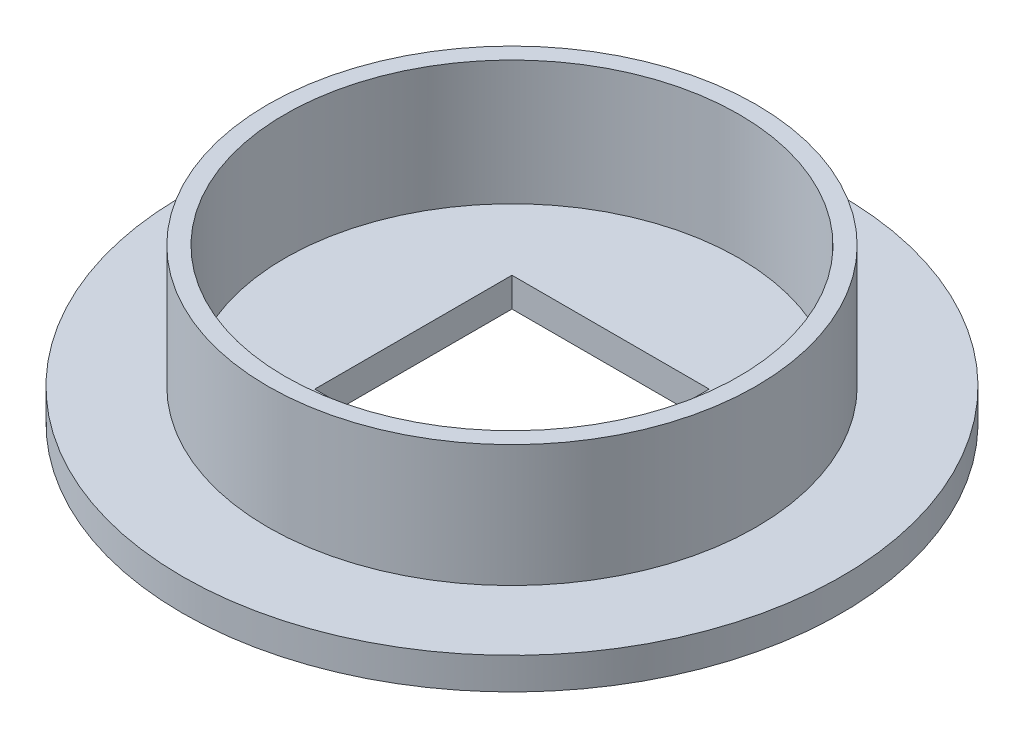
ISO-10303-21;
HEADER;
FILE_DESCRIPTION(('STEP AP214'),'2;1');
FILE_NAME('part.step','',(''),(''),'','','');
FILE_SCHEMA(('AUTOMOTIVE_DESIGN { 1 0 10303 214 1 1 1 1 }'));
ENDSEC;
DATA;
#1=APPLICATION_CONTEXT('core data for automotive mechanical design processes');
#2=APPLICATION_PROTOCOL_DEFINITION('international standard','automotive_design',2000,#1);
#3=PRODUCT_CONTEXT('',#1,'mechanical');
#4=PRODUCT('Part','Part','',(#3));
#5=PRODUCT_RELATED_PRODUCT_CATEGORY('part','',(#4));
#6=PRODUCT_DEFINITION_FORMATION('','',#4);
#7=PRODUCT_DEFINITION_CONTEXT('part definition',#1,'design');
#8=PRODUCT_DEFINITION('design','',#6,#7);
#9=PRODUCT_DEFINITION_SHAPE('','',#8);
#10=(LENGTH_UNIT() NAMED_UNIT(*) SI_UNIT(.MILLI.,.METRE.));
#11=(NAMED_UNIT(*) PLANE_ANGLE_UNIT() SI_UNIT($,.RADIAN.));
#12=(NAMED_UNIT(*) SI_UNIT($,.STERADIAN.) SOLID_ANGLE_UNIT());
#13=UNCERTAINTY_MEASURE_WITH_UNIT(LENGTH_MEASURE(1.E-05),#10,'distance_accuracy_value','');
#14=(GEOMETRIC_REPRESENTATION_CONTEXT(3) GLOBAL_UNCERTAINTY_ASSIGNED_CONTEXT((#13)) GLOBAL_UNIT_ASSIGNED_CONTEXT((#10,
#11,#12)) REPRESENTATION_CONTEXT('',''));
#15=CARTESIAN_POINT('',(0.,0.,0.));
#16=DIRECTION('',(0.,0.,1.));
#17=DIRECTION('',(1.,0.,0.));
#18=AXIS2_PLACEMENT_3D('',#15,#16,#17);
#19=CARTESIAN_POINT('',(0.,25.5,0.));
#20=DIRECTION('',(0.,1.,0.));
#21=DIRECTION('',(0.,0.,1.));
#22=AXIS2_PLACEMENT_3D('',#19,#20,#21);
#23=PLANE('',#22);
#24=CARTESIAN_POINT('',(0.,25.5,0.));
#25=DIRECTION('',(0.,1.,0.));
#26=DIRECTION('',(0.,0.,1.));
#27=AXIS2_PLACEMENT_3D('',#24,#25,#26);
#28=CIRCLE('',#27,50.);
#29=CARTESIAN_POINT('',(0.,25.5,50.));
#30=VERTEX_POINT('',#29);
#31=EDGE_CURVE('E194',#30,#30,#28,.T.);
#32=ORIENTED_EDGE('',*,*,#31,.T.);
#33=EDGE_LOOP('',(#32));
#34=FACE_BOUND('',#33,.T.);
#35=CARTESIAN_POINT('',(0.,25.5,0.));
#36=DIRECTION('',(0.,1.,0.));
#37=DIRECTION('',(0.,0.,1.));
#38=AXIS2_PLACEMENT_3D('',#35,#36,#37);
#39=CIRCLE('',#38,46.5);
#40=CARTESIAN_POINT('',(0.,25.5,46.5));
#41=VERTEX_POINT('',#40);
#42=EDGE_CURVE('E197',#41,#41,#39,.T.);
#43=ORIENTED_EDGE('',*,*,#42,.F.);
#44=EDGE_LOOP('',(#43));
#45=FACE_BOUND('',#44,.T.);
#46=ADVANCED_FACE('F42',(#34,#45),#23,.T.);
#47=CARTESIAN_POINT('',(0.,41.,0.));
#48=DIRECTION('',(0.,-1.,0.));
#49=DIRECTION('',(0.,0.,-1.));
#50=AXIS2_PLACEMENT_3D('',#47,#48,#49);
#51=CYLINDRICAL_SURFACE('',#50,46.5);
#52=CARTESIAN_POINT('',(0.,0.,0.));
#53=DIRECTION('',(0.,-1.,0.));
#54=DIRECTION('',(0.,0.,-1.));
#55=AXIS2_PLACEMENT_3D('',#52,#53,#54);
#56=CIRCLE('',#55,46.5);
#57=CARTESIAN_POINT('',(0.,0.,-46.5));
#58=VERTEX_POINT('',#57);
#59=EDGE_CURVE('E119',#58,#58,#56,.F.);
#60=ORIENTED_EDGE('',*,*,#59,.F.);
#61=EDGE_LOOP('',(#60));
#62=FACE_BOUND('',#61,.T.);
#63=ORIENTED_EDGE('',*,*,#42,.T.);
#64=EDGE_LOOP('',(#63));
#65=FACE_BOUND('',#64,.T.);
#66=ADVANCED_FACE('F44',(#62,#65),#51,.F.);
#67=CARTESIAN_POINT('',(-20.2,-6.,20.2));
#68=DIRECTION('',(-1.,0.,0.));
#69=DIRECTION('',(0.,0.,1.));
#70=AXIS2_PLACEMENT_3D('',#67,#68,#69);
#71=PLANE('',#70);
#72=DIRECTION('',(0.,1.,0.));
#73=VECTOR('',#72,1.);
#74=CARTESIAN_POINT('',(-20.2,-6.,20.2));
#75=LINE('',#74,#73);
#76=CARTESIAN_POINT('',(-20.2,-6.,20.2));
#77=VERTEX_POINT('',#76);
#78=CARTESIAN_POINT('',(-20.2,0.,20.2));
#79=VERTEX_POINT('',#78);
#80=EDGE_CURVE('E120',#77,#79,#75,.T.);
#81=ORIENTED_EDGE('',*,*,#80,.F.);
#82=DIRECTION('',(0.,0.,-1.));
#83=VECTOR('',#82,1.);
#84=CARTESIAN_POINT('',(-20.2,-5.99999999999999,20.2));
#85=LINE('',#84,#83);
#86=CARTESIAN_POINT('',(-20.2,-6.,-20.2));
#87=VERTEX_POINT('',#86);
#88=EDGE_CURVE('E11',#77,#87,#85,.T.);
#89=ORIENTED_EDGE('',*,*,#88,.T.);
#90=DIRECTION('',(0.,1.,0.));
#91=VECTOR('',#90,1.);
#92=CARTESIAN_POINT('',(-20.2,-6.,-20.2));
#93=LINE('',#92,#91);
#94=CARTESIAN_POINT('',(-20.2,0.,-20.2));
#95=VERTEX_POINT('',#94);
#96=EDGE_CURVE('E92',#87,#95,#93,.T.);
#97=ORIENTED_EDGE('',*,*,#96,.T.);
#98=DIRECTION('',(0.,0.,1.));
#99=VECTOR('',#98,1.);
#100=CARTESIAN_POINT('',(-20.2,0.,20.2));
#101=LINE('',#100,#99);
#102=EDGE_CURVE('E108',#95,#79,#101,.T.);
#103=ORIENTED_EDGE('',*,*,#102,.T.);
#104=EDGE_LOOP('',(#81,#89,#97,#103));
#105=FACE_BOUND('',#104,.T.);
#106=ADVANCED_FACE('F143',(#105),#71,.F.);
#107=CARTESIAN_POINT('',(0.,0.,0.));
#108=DIRECTION('',(0.,-1.,0.));
#109=DIRECTION('',(0.,0.,-1.));
#110=AXIS2_PLACEMENT_3D('',#107,#108,#109);
#111=PLANE('',#110);
#112=ORIENTED_EDGE('',*,*,#59,.T.);
#113=EDGE_LOOP('',(#112));
#114=FACE_BOUND('',#113,.T.);
#115=DIRECTION('',(0.,0.,-1.));
#116=VECTOR('',#115,1.);
#117=CARTESIAN_POINT('',(20.2,0.,20.2));
#118=LINE('',#117,#116);
#119=CARTESIAN_POINT('',(20.2,0.,20.2));
#120=VERTEX_POINT('',#119);
#121=CARTESIAN_POINT('',(20.2,0.,-20.2));
#122=VERTEX_POINT('',#121);
#123=EDGE_CURVE('E96',#120,#122,#118,.T.);
#124=ORIENTED_EDGE('',*,*,#123,.F.);
#125=DIRECTION('',(1.,0.,0.));
#126=VECTOR('',#125,1.);
#127=CARTESIAN_POINT('',(-20.2,0.,20.2));
#128=LINE('',#127,#126);
#129=EDGE_CURVE('E93',#79,#120,#128,.T.);
#130=ORIENTED_EDGE('',*,*,#129,.F.);
#131=ORIENTED_EDGE('',*,*,#102,.F.);
#132=DIRECTION('',(-1.,0.,0.));
#133=VECTOR('',#132,1.);
#134=CARTESIAN_POINT('',(-20.2,0.,-20.2));
#135=LINE('',#134,#133);
#136=EDGE_CURVE('E86',#122,#95,#135,.T.);
#137=ORIENTED_EDGE('',*,*,#136,.F.);
#138=EDGE_LOOP('',(#124,#130,#131,#137));
#139=FACE_BOUND('',#138,.T.);
#140=ADVANCED_FACE('F106',(#114,#139),#111,.F.);
#141=CARTESIAN_POINT('',(-20.2,-6.,20.2));
#142=DIRECTION('',(0.,0.,1.));
#143=DIRECTION('',(1.,0.,0.));
#144=AXIS2_PLACEMENT_3D('',#141,#142,#143);
#145=PLANE('',#144);
#146=DIRECTION('',(0.,1.,0.));
#147=VECTOR('',#146,1.);
#148=CARTESIAN_POINT('',(20.2,-6.,20.2));
#149=LINE('',#148,#147);
#150=CARTESIAN_POINT('',(20.2,-6.,20.2));
#151=VERTEX_POINT('',#150);
#152=EDGE_CURVE('E99',#151,#120,#149,.T.);
#153=ORIENTED_EDGE('',*,*,#152,.F.);
#154=DIRECTION('',(-1.,0.,0.));
#155=VECTOR('',#154,1.);
#156=CARTESIAN_POINT('',(-20.2,-5.99999999999999,20.2));
#157=LINE('',#156,#155);
#158=EDGE_CURVE('E51',#151,#77,#157,.T.);
#159=ORIENTED_EDGE('',*,*,#158,.T.);
#160=ORIENTED_EDGE('',*,*,#80,.T.);
#161=ORIENTED_EDGE('',*,*,#129,.T.);
#162=EDGE_LOOP('',(#153,#159,#160,#161));
#163=FACE_BOUND('',#162,.T.);
#164=ADVANCED_FACE('F142',(#163),#145,.F.);
#165=CARTESIAN_POINT('',(-20.2,-6.,-20.2));
#166=DIRECTION('',(0.,0.,-1.));
#167=DIRECTION('',(-1.,0.,0.));
#168=AXIS2_PLACEMENT_3D('',#165,#166,#167);
#169=PLANE('',#168);
#170=ORIENTED_EDGE('',*,*,#96,.F.);
#171=DIRECTION('',(1.,0.,0.));
#172=VECTOR('',#171,1.);
#173=CARTESIAN_POINT('',(-20.2,-5.99999999999999,-20.2));
#174=LINE('',#173,#172);
#175=CARTESIAN_POINT('',(20.2,-6.,-20.2));
#176=VERTEX_POINT('',#175);
#177=EDGE_CURVE('E88',#87,#176,#174,.T.);
#178=ORIENTED_EDGE('',*,*,#177,.T.);
#179=DIRECTION('',(0.,1.,0.));
#180=VECTOR('',#179,1.);
#181=CARTESIAN_POINT('',(20.2,-6.,-20.2));
#182=LINE('',#181,#180);
#183=EDGE_CURVE('E81',#176,#122,#182,.T.);
#184=ORIENTED_EDGE('',*,*,#183,.T.);
#185=ORIENTED_EDGE('',*,*,#136,.T.);
#186=EDGE_LOOP('',(#170,#178,#184,#185));
#187=FACE_BOUND('',#186,.T.);
#188=ADVANCED_FACE('F84',(#187),#169,.F.);
#189=CARTESIAN_POINT('',(20.2,-6.,20.2));
#190=DIRECTION('',(1.,0.,0.));
#191=DIRECTION('',(0.,0.,-1.));
#192=AXIS2_PLACEMENT_3D('',#189,#190,#191);
#193=PLANE('',#192);
#194=ORIENTED_EDGE('',*,*,#183,.F.);
#195=DIRECTION('',(0.,0.,1.));
#196=VECTOR('',#195,1.);
#197=CARTESIAN_POINT('',(20.2,-6.,20.2));
#198=LINE('',#197,#196);
#199=EDGE_CURVE('E136',#176,#151,#198,.T.);
#200=ORIENTED_EDGE('',*,*,#199,.T.);
#201=ORIENTED_EDGE('',*,*,#152,.T.);
#202=ORIENTED_EDGE('',*,*,#123,.T.);
#203=EDGE_LOOP('',(#194,#200,#201,#202));
#204=FACE_BOUND('',#203,.T.);
#205=ADVANCED_FACE('F97',(#204),#193,.F.);
#206=CARTESIAN_POINT('',(0.,-146.663996924429,0.));
#207=DIRECTION('',(0.,1.,0.));
#208=DIRECTION('',(0.,0.,1.));
#209=AXIS2_PLACEMENT_3D('',#206,#207,#208);
#210=CYLINDRICAL_SURFACE('',#209,50.);
#211=CARTESIAN_POINT('',(0.,0.5,0.));
#212=DIRECTION('',(0.,1.,0.));
#213=DIRECTION('',(0.,0.,1.));
#214=AXIS2_PLACEMENT_3D('',#211,#212,#213);
#215=CIRCLE('',#214,50.);
#216=CARTESIAN_POINT('',(0.,0.5,50.));
#217=VERTEX_POINT('',#216);
#218=EDGE_CURVE('E128',#217,#217,#215,.F.);
#219=ORIENTED_EDGE('',*,*,#218,.F.);
#220=EDGE_LOOP('',(#219));
#221=FACE_BOUND('',#220,.T.);
#222=ORIENTED_EDGE('',*,*,#31,.F.);
#223=EDGE_LOOP('',(#222));
#224=FACE_BOUND('',#223,.T.);
#225=ADVANCED_FACE('F173',(#221,#224),#210,.T.);
#226=CARTESIAN_POINT('',(0.,0.5,0.));
#227=DIRECTION('',(0.,1.,0.));
#228=DIRECTION('',(0.,0.,1.));
#229=AXIS2_PLACEMENT_3D('',#226,#227,#228);
#230=PLANE('',#229);
#231=CARTESIAN_POINT('',(0.,0.5,0.));
#232=DIRECTION('',(0.,1.,0.));
#233=DIRECTION('',(0.,0.,1.));
#234=AXIS2_PLACEMENT_3D('',#231,#232,#233);
#235=CIRCLE('',#234,67.5);
#236=CARTESIAN_POINT('',(0.,0.5,67.5));
#237=VERTEX_POINT('',#236);
#238=EDGE_CURVE('E132',#237,#237,#235,.T.);
#239=ORIENTED_EDGE('',*,*,#238,.T.);
#240=EDGE_LOOP('',(#239));
#241=FACE_BOUND('',#240,.T.);
#242=ORIENTED_EDGE('',*,*,#218,.T.);
#243=EDGE_LOOP('',(#242));
#244=FACE_BOUND('',#243,.T.);
#245=ADVANCED_FACE('F162',(#241,#244),#230,.T.);
#246=CARTESIAN_POINT('',(0.,-15.,0.));
#247=DIRECTION('',(0.,1.,0.));
#248=DIRECTION('',(0.,0.,1.));
#249=AXIS2_PLACEMENT_3D('',#246,#247,#248);
#250=CYLINDRICAL_SURFACE('',#249,67.5);
#251=CARTESIAN_POINT('',(0.,-6.,0.));
#252=DIRECTION('',(0.,-1.,0.));
#253=DIRECTION('',(0.,0.,-1.));
#254=AXIS2_PLACEMENT_3D('',#251,#252,#253);
#255=CIRCLE('',#254,67.5);
#256=CARTESIAN_POINT('',(0.,-6.,-67.5));
#257=VERTEX_POINT('',#256);
#258=EDGE_CURVE('E104',#257,#257,#255,.T.);
#259=ORIENTED_EDGE('',*,*,#258,.F.);
#260=EDGE_LOOP('',(#259));
#261=FACE_BOUND('',#260,.T.);
#262=ORIENTED_EDGE('',*,*,#238,.F.);
#263=EDGE_LOOP('',(#262));
#264=FACE_BOUND('',#263,.T.);
#265=ADVANCED_FACE('F156',(#261,#264),#250,.T.);
#266=CARTESIAN_POINT('',(0.,-6.,0.));
#267=DIRECTION('',(0.,-1.,0.));
#268=DIRECTION('',(0.,0.,-1.));
#269=AXIS2_PLACEMENT_3D('',#266,#267,#268);
#270=PLANE('',#269);
#271=ORIENTED_EDGE('',*,*,#258,.T.);
#272=EDGE_LOOP('',(#271));
#273=FACE_BOUND('',#272,.T.);
#274=ORIENTED_EDGE('',*,*,#158,.F.);
#275=ORIENTED_EDGE('',*,*,#199,.F.);
#276=ORIENTED_EDGE('',*,*,#177,.F.);
#277=ORIENTED_EDGE('',*,*,#88,.F.);
#278=EDGE_LOOP('',(#274,#275,#276,#277));
#279=FACE_BOUND('',#278,.T.);
#280=ADVANCED_FACE('F154',(#273,#279),#270,.T.);
#281=CLOSED_SHELL('',(#46,#66,#106,#140,#164,#188,#205,#225,#245,#265,#280));
#282=MANIFOLD_SOLID_BREP('B2',#281);
#283=ADVANCED_BREP_SHAPE_REPRESENTATION('',(#18,#282),#14);
#284=SHAPE_DEFINITION_REPRESENTATION(#9,#283);
ENDSEC;
END-ISO-10303-21;
